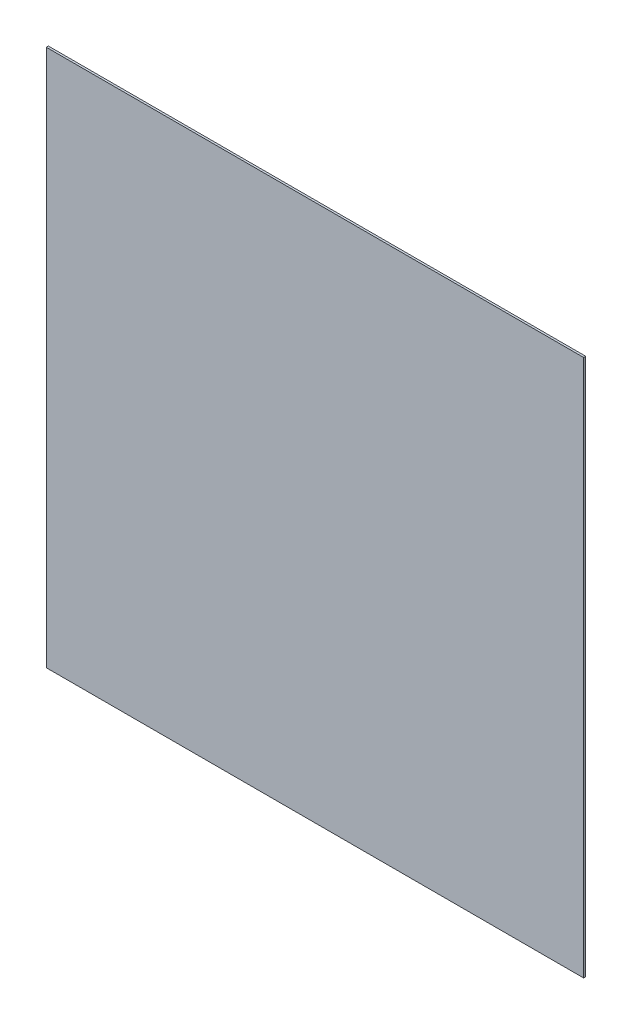
ISO-10303-21;
HEADER;
FILE_DESCRIPTION(('STEP AP214'),'2;1');
FILE_NAME('part.step','',(''),(''),'','','');
FILE_SCHEMA(('AUTOMOTIVE_DESIGN { 1 0 10303 214 1 1 1 1 }'));
ENDSEC;
DATA;
#1=APPLICATION_CONTEXT('core data for automotive mechanical design processes');
#2=APPLICATION_PROTOCOL_DEFINITION('international standard','automotive_design',2000,#1);
#3=PRODUCT_CONTEXT('',#1,'mechanical');
#4=PRODUCT('Part','Part','',(#3));
#5=PRODUCT_RELATED_PRODUCT_CATEGORY('part','',(#4));
#6=PRODUCT_DEFINITION_FORMATION('','',#4);
#7=PRODUCT_DEFINITION_CONTEXT('part definition',#1,'design');
#8=PRODUCT_DEFINITION('design','',#6,#7);
#9=PRODUCT_DEFINITION_SHAPE('','',#8);
#10=(LENGTH_UNIT() NAMED_UNIT(*) SI_UNIT(.MILLI.,.METRE.));
#11=(NAMED_UNIT(*) PLANE_ANGLE_UNIT() SI_UNIT($,.RADIAN.));
#12=(NAMED_UNIT(*) SI_UNIT($,.STERADIAN.) SOLID_ANGLE_UNIT());
#13=UNCERTAINTY_MEASURE_WITH_UNIT(LENGTH_MEASURE(1.E-05),#10,'distance_accuracy_value','');
#14=(GEOMETRIC_REPRESENTATION_CONTEXT(3) GLOBAL_UNCERTAINTY_ASSIGNED_CONTEXT((#13)) GLOBAL_UNIT_ASSIGNED_CONTEXT((#10,
#11,#12)) REPRESENTATION_CONTEXT('',''));
#15=CARTESIAN_POINT('',(0.,0.,0.));
#16=DIRECTION('',(0.,0.,1.));
#17=DIRECTION('',(1.,0.,0.));
#18=AXIS2_PLACEMENT_3D('',#15,#16,#17);
#19=CARTESIAN_POINT('',(-413.368421052632,286.385964912281,3.));
#20=DIRECTION('',(1.,0.,0.));
#21=DIRECTION('',(0.,1.,0.));
#22=AXIS2_PLACEMENT_3D('',#19,#20,#21);
#23=PLANE('',#22);
#24=DIRECTION('',(0.,-1.,0.));
#25=VECTOR('',#24,1.);
#26=CARTESIAN_POINT('',(-413.368421052632,286.385964912281,0.));
#27=LINE('',#26,#25);
#28=CARTESIAN_POINT('',(-413.368421052632,286.385964912281,0.));
#29=VERTEX_POINT('',#28);
#30=CARTESIAN_POINT('',(-413.368421052632,-483.614035087719,0.));
#31=VERTEX_POINT('',#30);
#32=EDGE_CURVE('E96',#29,#31,#27,.T.);
#33=ORIENTED_EDGE('',*,*,#32,.T.);
#34=DIRECTION('',(0.,0.,-1.));
#35=VECTOR('',#34,1.);
#36=CARTESIAN_POINT('',(-413.368421052632,-483.614035087719,3.));
#37=LINE('',#36,#35);
#38=CARTESIAN_POINT('',(-413.368421052632,-483.614035087719,3.));
#39=VERTEX_POINT('',#38);
#40=EDGE_CURVE('E11',#39,#31,#37,.T.);
#41=ORIENTED_EDGE('',*,*,#40,.F.);
#42=DIRECTION('',(0.,-1.,0.));
#43=VECTOR('',#42,1.);
#44=CARTESIAN_POINT('',(-413.368421052632,286.385964912281,3.));
#45=LINE('',#44,#43);
#46=CARTESIAN_POINT('',(-413.368421052632,286.385964912281,3.));
#47=VERTEX_POINT('',#46);
#48=EDGE_CURVE('E84',#47,#39,#45,.T.);
#49=ORIENTED_EDGE('',*,*,#48,.F.);
#50=DIRECTION('',(0.,0.,-1.));
#51=VECTOR('',#50,1.);
#52=CARTESIAN_POINT('',(-413.368421052632,286.385964912281,3.));
#53=LINE('',#52,#51);
#54=EDGE_CURVE('E92',#47,#29,#53,.T.);
#55=ORIENTED_EDGE('',*,*,#54,.T.);
#56=EDGE_LOOP('',(#33,#41,#49,#55));
#57=FACE_BOUND('',#56,.T.);
#58=ADVANCED_FACE('F33',(#57),#23,.F.);
#59=CARTESIAN_POINT('',(-413.368421052632,-483.614035087719,3.));
#60=DIRECTION('',(0.,1.,0.));
#61=DIRECTION('',(0.,0.,1.));
#62=AXIS2_PLACEMENT_3D('',#59,#60,#61);
#63=PLANE('',#62);
#64=DIRECTION('',(1.,0.,0.));
#65=VECTOR('',#64,1.);
#66=CARTESIAN_POINT('',(-413.368421052632,-483.614035087719,0.));
#67=LINE('',#66,#65);
#68=CARTESIAN_POINT('',(356.631578947368,-483.614035087719,0.));
#69=VERTEX_POINT('',#68);
#70=EDGE_CURVE('E88',#31,#69,#67,.T.);
#71=ORIENTED_EDGE('',*,*,#70,.T.);
#72=DIRECTION('',(0.,0.,-1.));
#73=VECTOR('',#72,1.);
#74=CARTESIAN_POINT('',(356.631578947368,-483.614035087719,3.));
#75=LINE('',#74,#73);
#76=CARTESIAN_POINT('',(356.631578947368,-483.614035087719,3.));
#77=VERTEX_POINT('',#76);
#78=EDGE_CURVE('E41',#77,#69,#75,.T.);
#79=ORIENTED_EDGE('',*,*,#78,.F.);
#80=DIRECTION('',(1.,0.,0.));
#81=VECTOR('',#80,1.);
#82=CARTESIAN_POINT('',(-413.368421052632,-483.614035087719,3.));
#83=LINE('',#82,#81);
#84=EDGE_CURVE('E79',#39,#77,#83,.T.);
#85=ORIENTED_EDGE('',*,*,#84,.F.);
#86=ORIENTED_EDGE('',*,*,#40,.T.);
#87=EDGE_LOOP('',(#71,#79,#85,#86));
#88=FACE_BOUND('',#87,.T.);
#89=ADVANCED_FACE('F87',(#88),#63,.F.);
#90=CARTESIAN_POINT('',(356.631578947368,286.385964912281,3.));
#91=DIRECTION('',(-1.,0.,0.));
#92=DIRECTION('',(0.,-1.,0.));
#93=AXIS2_PLACEMENT_3D('',#90,#91,#92);
#94=PLANE('',#93);
#95=DIRECTION('',(0.,1.,0.));
#96=VECTOR('',#95,1.);
#97=CARTESIAN_POINT('',(356.631578947368,286.385964912281,0.));
#98=LINE('',#97,#96);
#99=CARTESIAN_POINT('',(356.631578947368,286.385964912281,0.));
#100=VERTEX_POINT('',#99);
#101=EDGE_CURVE('E66',#69,#100,#98,.T.);
#102=ORIENTED_EDGE('',*,*,#101,.T.);
#103=DIRECTION('',(0.,0.,-1.));
#104=VECTOR('',#103,1.);
#105=CARTESIAN_POINT('',(356.631578947368,286.385964912281,3.));
#106=LINE('',#105,#104);
#107=CARTESIAN_POINT('',(356.631578947368,286.385964912281,3.));
#108=VERTEX_POINT('',#107);
#109=EDGE_CURVE('E89',#108,#100,#106,.T.);
#110=ORIENTED_EDGE('',*,*,#109,.F.);
#111=DIRECTION('',(0.,1.,0.));
#112=VECTOR('',#111,1.);
#113=CARTESIAN_POINT('',(356.631578947368,286.385964912281,3.));
#114=LINE('',#113,#112);
#115=EDGE_CURVE('E82',#77,#108,#114,.T.);
#116=ORIENTED_EDGE('',*,*,#115,.F.);
#117=ORIENTED_EDGE('',*,*,#78,.T.);
#118=EDGE_LOOP('',(#102,#110,#116,#117));
#119=FACE_BOUND('',#118,.T.);
#120=ADVANCED_FACE('F90',(#119),#94,.F.);
#121=CARTESIAN_POINT('',(-413.368421052632,286.385964912281,3.));
#122=DIRECTION('',(0.,-1.,0.));
#123=DIRECTION('',(0.,0.,-1.));
#124=AXIS2_PLACEMENT_3D('',#121,#122,#123);
#125=PLANE('',#124);
#126=DIRECTION('',(-1.,0.,0.));
#127=VECTOR('',#126,1.);
#128=CARTESIAN_POINT('',(-413.368421052632,286.385964912281,0.));
#129=LINE('',#128,#127);
#130=EDGE_CURVE('E72',#100,#29,#129,.T.);
#131=ORIENTED_EDGE('',*,*,#130,.T.);
#132=ORIENTED_EDGE('',*,*,#54,.F.);
#133=DIRECTION('',(-1.,0.,0.));
#134=VECTOR('',#133,1.);
#135=CARTESIAN_POINT('',(-413.368421052632,286.385964912281,3.));
#136=LINE('',#135,#134);
#137=EDGE_CURVE('E49',#108,#47,#136,.T.);
#138=ORIENTED_EDGE('',*,*,#137,.F.);
#139=ORIENTED_EDGE('',*,*,#109,.T.);
#140=EDGE_LOOP('',(#131,#132,#138,#139));
#141=FACE_BOUND('',#140,.T.);
#142=ADVANCED_FACE('F103',(#141),#125,.F.);
#143=CARTESIAN_POINT('',(0.,0.,3.));
#144=DIRECTION('',(0.,0.,1.));
#145=DIRECTION('',(1.,0.,0.));
#146=AXIS2_PLACEMENT_3D('',#143,#144,#145);
#147=PLANE('',#146);
#148=ORIENTED_EDGE('',*,*,#48,.T.);
#149=ORIENTED_EDGE('',*,*,#84,.T.);
#150=ORIENTED_EDGE('',*,*,#115,.T.);
#151=ORIENTED_EDGE('',*,*,#137,.T.);
#152=EDGE_LOOP('',(#148,#149,#150,#151));
#153=FACE_BOUND('',#152,.T.);
#154=ADVANCED_FACE('F80',(#153),#147,.T.);
#155=CARTESIAN_POINT('',(0.,0.,0.));
#156=DIRECTION('',(0.,0.,1.));
#157=DIRECTION('',(1.,0.,0.));
#158=AXIS2_PLACEMENT_3D('',#155,#156,#157);
#159=PLANE('',#158);
#160=ORIENTED_EDGE('',*,*,#32,.F.);
#161=ORIENTED_EDGE('',*,*,#130,.F.);
#162=ORIENTED_EDGE('',*,*,#101,.F.);
#163=ORIENTED_EDGE('',*,*,#70,.F.);
#164=EDGE_LOOP('',(#160,#161,#162,#163));
#165=FACE_BOUND('',#164,.T.);
#166=ADVANCED_FACE('F106',(#165),#159,.F.);
#167=CLOSED_SHELL('',(#58,#89,#120,#142,#154,#166));
#168=MANIFOLD_SOLID_BREP('B2',#167);
#169=ADVANCED_BREP_SHAPE_REPRESENTATION('',(#18,#168),#14);
#170=SHAPE_DEFINITION_REPRESENTATION(#9,#169);
ENDSEC;
END-ISO-10303-21;
